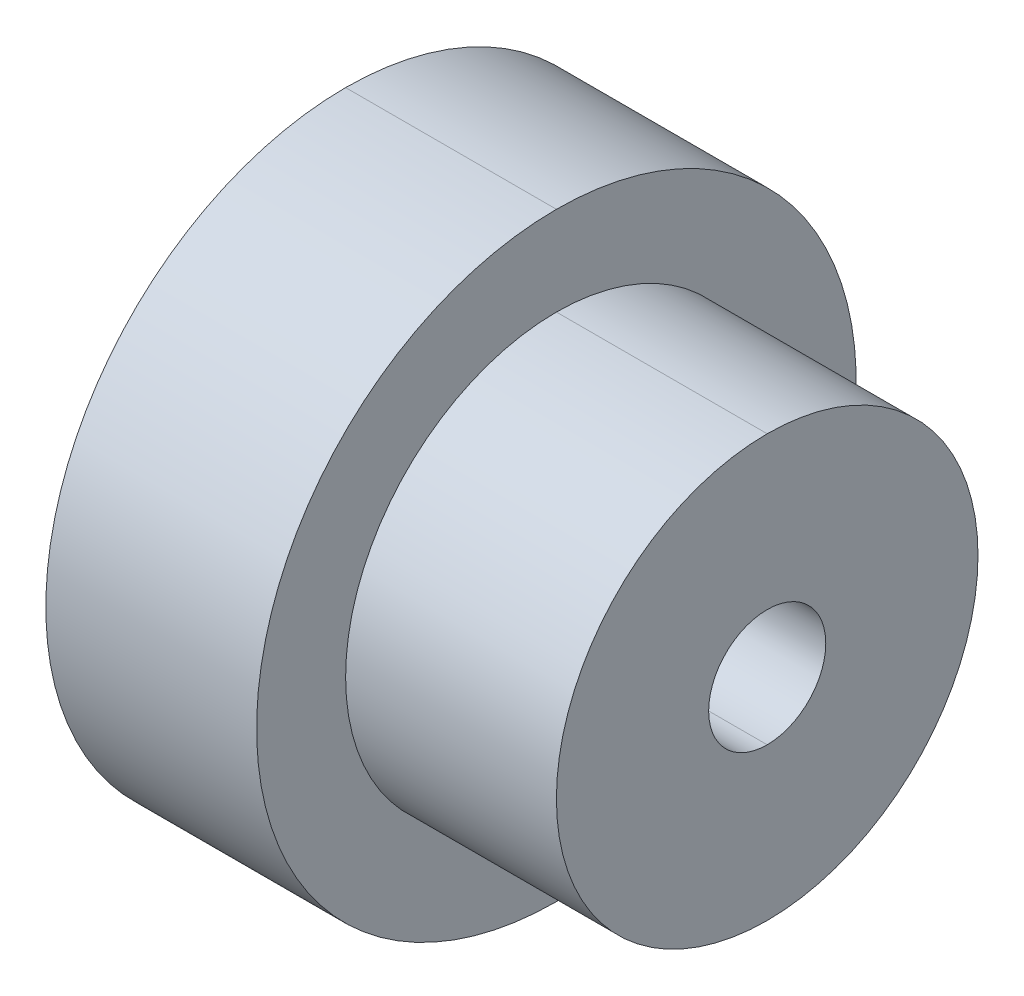
ISO-10303-21;
HEADER;
FILE_DESCRIPTION(('STEP AP214'),'2;1');
FILE_NAME('part.step','',(''),(''),'','','');
FILE_SCHEMA(('AUTOMOTIVE_DESIGN { 1 0 10303 214 1 1 1 1 }'));
ENDSEC;
DATA;
#1=APPLICATION_CONTEXT('core data for automotive mechanical design processes');
#2=APPLICATION_PROTOCOL_DEFINITION('international standard','automotive_design',2000,#1);
#3=PRODUCT_CONTEXT('',#1,'mechanical');
#4=PRODUCT('Part','Part','',(#3));
#5=PRODUCT_RELATED_PRODUCT_CATEGORY('part','',(#4));
#6=PRODUCT_DEFINITION_FORMATION('','',#4);
#7=PRODUCT_DEFINITION_CONTEXT('part definition',#1,'design');
#8=PRODUCT_DEFINITION('design','',#6,#7);
#9=PRODUCT_DEFINITION_SHAPE('','',#8);
#10=(LENGTH_UNIT() NAMED_UNIT(*) SI_UNIT(.MILLI.,.METRE.));
#11=(NAMED_UNIT(*) PLANE_ANGLE_UNIT() SI_UNIT($,.RADIAN.));
#12=(NAMED_UNIT(*) SI_UNIT($,.STERADIAN.) SOLID_ANGLE_UNIT());
#13=UNCERTAINTY_MEASURE_WITH_UNIT(LENGTH_MEASURE(1.E-05),#10,'distance_accuracy_value','');
#14=(GEOMETRIC_REPRESENTATION_CONTEXT(3) GLOBAL_UNCERTAINTY_ASSIGNED_CONTEXT((#13)) GLOBAL_UNIT_ASSIGNED_CONTEXT((#10,
#11,#12)) REPRESENTATION_CONTEXT('',''));
#15=CARTESIAN_POINT('',(0.,0.,0.));
#16=DIRECTION('',(0.,0.,1.));
#17=DIRECTION('',(1.,0.,0.));
#18=AXIS2_PLACEMENT_3D('',#15,#16,#17);
#19=CARTESIAN_POINT('',(18.,0.,0.));
#20=DIRECTION('',(-1.,0.,0.));
#21=DIRECTION('',(0.,-1.,0.));
#22=AXIS2_PLACEMENT_3D('',#19,#20,#21);
#23=CYLINDRICAL_SURFACE('',#22,2.5);
#24=DIRECTION('',(-1.,0.,0.));
#25=VECTOR('',#24,1.);
#26=CARTESIAN_POINT('',(18.,2.5,0.));
#27=LINE('',#26,#25);
#28=CARTESIAN_POINT('',(18.,2.5,0.));
#29=VERTEX_POINT('',#28);
#30=CARTESIAN_POINT('',(0.,2.5,0.));
#31=VERTEX_POINT('',#30);
#32=EDGE_CURVE('E94',#29,#31,#27,.T.);
#33=ORIENTED_EDGE('',*,*,#32,.F.);
#34=CARTESIAN_POINT('',(18.,0.,0.));
#35=DIRECTION('',(-1.,0.,0.));
#36=DIRECTION('',(0.,-1.,0.));
#37=AXIS2_PLACEMENT_3D('',#34,#35,#36);
#38=CIRCLE('',#37,2.5);
#39=CARTESIAN_POINT('',(18.,-2.5,0.));
#40=VERTEX_POINT('',#39);
#41=EDGE_CURVE('E10',#40,#29,#38,.T.);
#42=ORIENTED_EDGE('',*,*,#41,.F.);
#43=DIRECTION('',(-1.,0.,0.));
#44=VECTOR('',#43,1.);
#45=CARTESIAN_POINT('',(18.,-2.5,0.));
#46=LINE('',#45,#44);
#47=CARTESIAN_POINT('',(0.,-2.5,0.));
#48=VERTEX_POINT('',#47);
#49=EDGE_CURVE('E103',#40,#48,#46,.T.);
#50=ORIENTED_EDGE('',*,*,#49,.T.);
#51=CARTESIAN_POINT('',(0.,0.,0.));
#52=DIRECTION('',(-1.,0.,0.));
#53=DIRECTION('',(0.,-1.,0.));
#54=AXIS2_PLACEMENT_3D('',#51,#52,#53);
#55=CIRCLE('',#54,2.5);
#56=EDGE_CURVE('E95',#48,#31,#55,.T.);
#57=ORIENTED_EDGE('',*,*,#56,.T.);
#58=EDGE_LOOP('',(#33,#42,#50,#57));
#59=FACE_BOUND('',#58,.T.);
#60=ADVANCED_FACE('F16',(#59),#23,.F.);
#61=CARTESIAN_POINT('',(18.,9.,0.));
#62=DIRECTION('',(1.,0.,0.));
#63=DIRECTION('',(0.,-1.,0.));
#64=AXIS2_PLACEMENT_3D('',#61,#62,#63);
#65=PLANE('',#64);
#66=ORIENTED_EDGE('',*,*,#41,.T.);
#67=CARTESIAN_POINT('',(18.,0.,0.));
#68=DIRECTION('',(-1.,0.,0.));
#69=DIRECTION('',(0.,-1.,0.));
#70=AXIS2_PLACEMENT_3D('',#67,#68,#69);
#71=CIRCLE('',#70,2.5);
#72=EDGE_CURVE('E89',#29,#40,#71,.T.);
#73=ORIENTED_EDGE('',*,*,#72,.T.);
#74=EDGE_LOOP('',(#66,#73));
#75=FACE_BOUND('',#74,.T.);
#76=CARTESIAN_POINT('',(18.,0.,0.));
#77=DIRECTION('',(1.,0.,0.));
#78=DIRECTION('',(0.,1.,0.));
#79=AXIS2_PLACEMENT_3D('',#76,#77,#78);
#80=CIRCLE('',#79,9.);
#81=CARTESIAN_POINT('',(18.,9.,0.));
#82=VERTEX_POINT('',#81);
#83=CARTESIAN_POINT('',(18.,-9.,0.));
#84=VERTEX_POINT('',#83);
#85=EDGE_CURVE('E126',#82,#84,#80,.T.);
#86=ORIENTED_EDGE('',*,*,#85,.T.);
#87=CARTESIAN_POINT('',(18.,0.,0.));
#88=DIRECTION('',(1.,0.,0.));
#89=DIRECTION('',(0.,1.,0.));
#90=AXIS2_PLACEMENT_3D('',#87,#88,#89);
#91=CIRCLE('',#90,9.);
#92=EDGE_CURVE('E24',#84,#82,#91,.T.);
#93=ORIENTED_EDGE('',*,*,#92,.T.);
#94=EDGE_LOOP('',(#86,#93));
#95=FACE_BOUND('',#94,.T.);
#96=ADVANCED_FACE('F86',(#75,#95),#65,.T.);
#97=CARTESIAN_POINT('',(18.,0.,0.));
#98=DIRECTION('',(1.,0.,0.));
#99=DIRECTION('',(0.,1.,0.));
#100=AXIS2_PLACEMENT_3D('',#97,#98,#99);
#101=CYLINDRICAL_SURFACE('',#100,9.);
#102=DIRECTION('',(1.,0.,0.));
#103=VECTOR('',#102,1.);
#104=CARTESIAN_POINT('',(18.,-9.,0.));
#105=LINE('',#104,#103);
#106=CARTESIAN_POINT('',(9.,-9.,0.));
#107=VERTEX_POINT('',#106);
#108=EDGE_CURVE('E110',#107,#84,#105,.T.);
#109=ORIENTED_EDGE('',*,*,#108,.F.);
#110=CARTESIAN_POINT('',(9.,0.,0.));
#111=DIRECTION('',(1.,0.,0.));
#112=DIRECTION('',(0.,1.,0.));
#113=AXIS2_PLACEMENT_3D('',#110,#111,#112);
#114=CIRCLE('',#113,9.);
#115=CARTESIAN_POINT('',(9.,9.,0.));
#116=VERTEX_POINT('',#115);
#117=EDGE_CURVE('E137',#107,#116,#114,.T.);
#118=ORIENTED_EDGE('',*,*,#117,.T.);
#119=DIRECTION('',(1.,0.,0.));
#120=VECTOR('',#119,1.);
#121=CARTESIAN_POINT('',(18.,9.,0.));
#122=LINE('',#121,#120);
#123=EDGE_CURVE('E130',#116,#82,#122,.T.);
#124=ORIENTED_EDGE('',*,*,#123,.T.);
#125=ORIENTED_EDGE('',*,*,#92,.F.);
#126=EDGE_LOOP('',(#109,#118,#124,#125));
#127=FACE_BOUND('',#126,.T.);
#128=ADVANCED_FACE('F159',(#127),#101,.T.);
#129=CARTESIAN_POINT('',(9.,12.8,0.));
#130=DIRECTION('',(1.,0.,0.));
#131=DIRECTION('',(0.,-1.,0.));
#132=AXIS2_PLACEMENT_3D('',#129,#130,#131);
#133=PLANE('',#132);
#134=CARTESIAN_POINT('',(9.,0.,0.));
#135=DIRECTION('',(1.,0.,0.));
#136=DIRECTION('',(0.,1.,0.));
#137=AXIS2_PLACEMENT_3D('',#134,#135,#136);
#138=CIRCLE('',#137,9.);
#139=EDGE_CURVE('E122',#116,#107,#138,.T.);
#140=ORIENTED_EDGE('',*,*,#139,.F.);
#141=ORIENTED_EDGE('',*,*,#117,.F.);
#142=EDGE_LOOP('',(#140,#141));
#143=FACE_BOUND('',#142,.T.);
#144=CARTESIAN_POINT('',(9.,0.,0.));
#145=DIRECTION('',(1.,0.,0.));
#146=DIRECTION('',(0.,1.,0.));
#147=AXIS2_PLACEMENT_3D('',#144,#145,#146);
#148=CIRCLE('',#147,12.8);
#149=CARTESIAN_POINT('',(9.,12.8,0.));
#150=VERTEX_POINT('',#149);
#151=CARTESIAN_POINT('',(9.,-12.8,0.));
#152=VERTEX_POINT('',#151);
#153=EDGE_CURVE('E116',#150,#152,#148,.T.);
#154=ORIENTED_EDGE('',*,*,#153,.T.);
#155=CARTESIAN_POINT('',(9.,0.,0.));
#156=DIRECTION('',(1.,0.,0.));
#157=DIRECTION('',(0.,1.,0.));
#158=AXIS2_PLACEMENT_3D('',#155,#156,#157);
#159=CIRCLE('',#158,12.8);
#160=EDGE_CURVE('E36',#152,#150,#159,.T.);
#161=ORIENTED_EDGE('',*,*,#160,.T.);
#162=EDGE_LOOP('',(#154,#161));
#163=FACE_BOUND('',#162,.T.);
#164=ADVANCED_FACE('F275',(#143,#163),#133,.T.);
#165=CARTESIAN_POINT('',(18.,0.,0.));
#166=DIRECTION('',(1.,0.,0.));
#167=DIRECTION('',(0.,1.,0.));
#168=AXIS2_PLACEMENT_3D('',#165,#166,#167);
#169=CYLINDRICAL_SURFACE('',#168,12.8);
#170=DIRECTION('',(1.,0.,0.));
#171=VECTOR('',#170,1.);
#172=CARTESIAN_POINT('',(18.,-12.8,0.));
#173=LINE('',#172,#171);
#174=CARTESIAN_POINT('',(0.,-12.8,0.));
#175=VERTEX_POINT('',#174);
#176=EDGE_CURVE('E112',#175,#152,#173,.T.);
#177=ORIENTED_EDGE('',*,*,#176,.F.);
#178=CARTESIAN_POINT('',(0.,0.,0.));
#179=DIRECTION('',(1.,0.,0.));
#180=DIRECTION('',(0.,1.,0.));
#181=AXIS2_PLACEMENT_3D('',#178,#179,#180);
#182=CIRCLE('',#181,12.8);
#183=CARTESIAN_POINT('',(0.,12.8,0.));
#184=VERTEX_POINT('',#183);
#185=EDGE_CURVE('E145',#175,#184,#182,.T.);
#186=ORIENTED_EDGE('',*,*,#185,.T.);
#187=DIRECTION('',(1.,0.,0.));
#188=VECTOR('',#187,1.);
#189=CARTESIAN_POINT('',(18.,12.8,0.));
#190=LINE('',#189,#188);
#191=EDGE_CURVE('E142',#184,#150,#190,.T.);
#192=ORIENTED_EDGE('',*,*,#191,.T.);
#193=ORIENTED_EDGE('',*,*,#160,.F.);
#194=EDGE_LOOP('',(#177,#186,#192,#193));
#195=FACE_BOUND('',#194,.T.);
#196=ADVANCED_FACE('F270',(#195),#169,.T.);
#197=CARTESIAN_POINT('',(0.,0.,0.));
#198=DIRECTION('',(-1.,0.,0.));
#199=DIRECTION('',(0.,0.,1.));
#200=AXIS2_PLACEMENT_3D('',#197,#198,#199);
#201=PLANE('',#200);
#202=ORIENTED_EDGE('',*,*,#56,.F.);
#203=CARTESIAN_POINT('',(0.,0.,0.));
#204=DIRECTION('',(-1.,0.,0.));
#205=DIRECTION('',(0.,-1.,0.));
#206=AXIS2_PLACEMENT_3D('',#203,#204,#205);
#207=CIRCLE('',#206,2.5);
#208=EDGE_CURVE('E100',#31,#48,#207,.T.);
#209=ORIENTED_EDGE('',*,*,#208,.F.);
#210=EDGE_LOOP('',(#202,#209));
#211=FACE_BOUND('',#210,.T.);
#212=CARTESIAN_POINT('',(0.,0.,0.));
#213=DIRECTION('',(1.,0.,0.));
#214=DIRECTION('',(0.,1.,0.));
#215=AXIS2_PLACEMENT_3D('',#212,#213,#214);
#216=CIRCLE('',#215,12.8);
#217=EDGE_CURVE('E117',#184,#175,#216,.T.);
#218=ORIENTED_EDGE('',*,*,#217,.F.);
#219=ORIENTED_EDGE('',*,*,#185,.F.);
#220=EDGE_LOOP('',(#218,#219));
#221=FACE_BOUND('',#220,.T.);
#222=ADVANCED_FACE('F274',(#211,#221),#201,.T.);
#223=CARTESIAN_POINT('',(18.,0.,0.));
#224=DIRECTION('',(1.,0.,0.));
#225=DIRECTION('',(0.,1.,0.));
#226=AXIS2_PLACEMENT_3D('',#223,#224,#225);
#227=CYLINDRICAL_SURFACE('',#226,12.8);
#228=ORIENTED_EDGE('',*,*,#217,.T.);
#229=ORIENTED_EDGE('',*,*,#176,.T.);
#230=ORIENTED_EDGE('',*,*,#153,.F.);
#231=ORIENTED_EDGE('',*,*,#191,.F.);
#232=EDGE_LOOP('',(#228,#229,#230,#231));
#233=FACE_BOUND('',#232,.T.);
#234=ADVANCED_FACE('F263',(#233),#227,.T.);
#235=CARTESIAN_POINT('',(18.,0.,0.));
#236=DIRECTION('',(1.,0.,0.));
#237=DIRECTION('',(0.,1.,0.));
#238=AXIS2_PLACEMENT_3D('',#235,#236,#237);
#239=CYLINDRICAL_SURFACE('',#238,9.);
#240=ORIENTED_EDGE('',*,*,#139,.T.);
#241=ORIENTED_EDGE('',*,*,#108,.T.);
#242=ORIENTED_EDGE('',*,*,#85,.F.);
#243=ORIENTED_EDGE('',*,*,#123,.F.);
#244=EDGE_LOOP('',(#240,#241,#242,#243));
#245=FACE_BOUND('',#244,.T.);
#246=ADVANCED_FACE('F162',(#245),#239,.T.);
#247=CARTESIAN_POINT('',(18.,0.,0.));
#248=DIRECTION('',(-1.,0.,0.));
#249=DIRECTION('',(0.,-1.,0.));
#250=AXIS2_PLACEMENT_3D('',#247,#248,#249);
#251=CYLINDRICAL_SURFACE('',#250,2.5);
#252=ORIENTED_EDGE('',*,*,#72,.F.);
#253=ORIENTED_EDGE('',*,*,#32,.T.);
#254=ORIENTED_EDGE('',*,*,#208,.T.);
#255=ORIENTED_EDGE('',*,*,#49,.F.);
#256=EDGE_LOOP('',(#252,#253,#254,#255));
#257=FACE_BOUND('',#256,.T.);
#258=ADVANCED_FACE('F102',(#257),#251,.F.);
#259=CLOSED_SHELL('',(#60,#96,#128,#164,#196,#222,#234,#246,#258));
#260=MANIFOLD_SOLID_BREP('B1',#259);
#261=ADVANCED_BREP_SHAPE_REPRESENTATION('',(#18,#260),#14);
#262=SHAPE_DEFINITION_REPRESENTATION(#9,#261);
ENDSEC;
END-ISO-10303-21;
